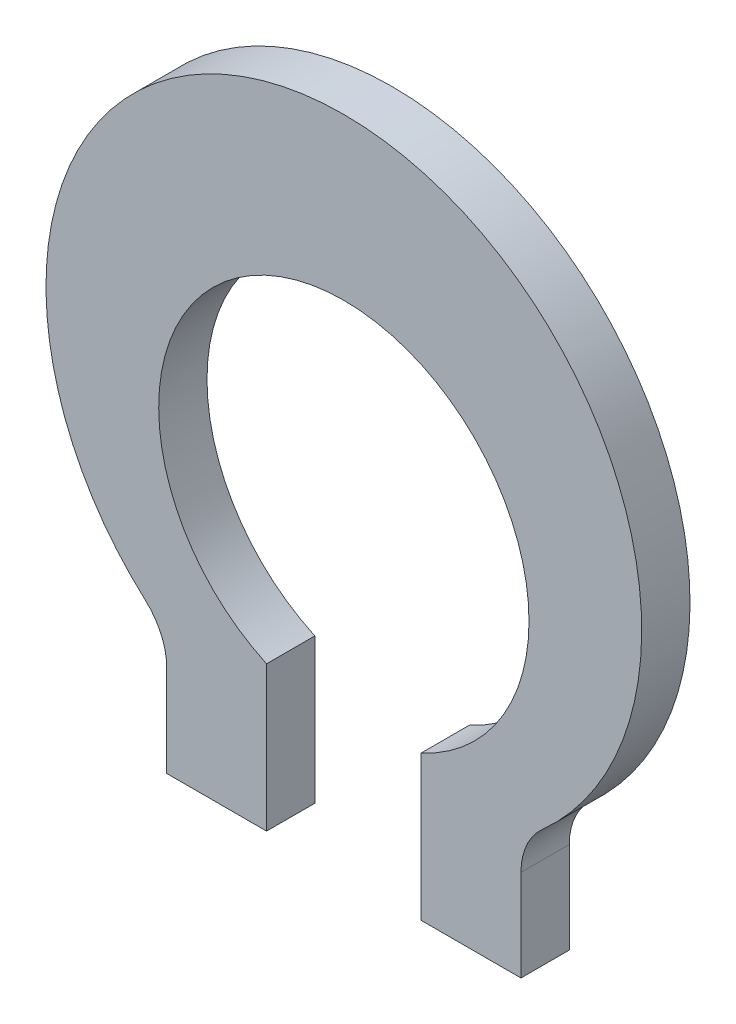
ISO-10303-21;
HEADER;
FILE_DESCRIPTION(('STEP AP214'),'2;1');
FILE_NAME('part.step','',(''),(''),'','','');
FILE_SCHEMA(('AUTOMOTIVE_DESIGN { 1 0 10303 214 1 1 1 1 }'));
ENDSEC;
DATA;
#1=APPLICATION_CONTEXT('core data for automotive mechanical design processes');
#2=APPLICATION_PROTOCOL_DEFINITION('international standard','automotive_design',2000,#1);
#3=PRODUCT_CONTEXT('',#1,'mechanical');
#4=PRODUCT('Part','Part','',(#3));
#5=PRODUCT_RELATED_PRODUCT_CATEGORY('part','',(#4));
#6=PRODUCT_DEFINITION_FORMATION('','',#4);
#7=PRODUCT_DEFINITION_CONTEXT('part definition',#1,'design');
#8=PRODUCT_DEFINITION('design','',#6,#7);
#9=PRODUCT_DEFINITION_SHAPE('','',#8);
#10=(LENGTH_UNIT() NAMED_UNIT(*) SI_UNIT(.MILLI.,.METRE.));
#11=(NAMED_UNIT(*) PLANE_ANGLE_UNIT() SI_UNIT($,.RADIAN.));
#12=(NAMED_UNIT(*) SI_UNIT($,.STERADIAN.) SOLID_ANGLE_UNIT());
#13=UNCERTAINTY_MEASURE_WITH_UNIT(LENGTH_MEASURE(1.E-05),#10,'distance_accuracy_value','');
#14=(GEOMETRIC_REPRESENTATION_CONTEXT(3) GLOBAL_UNCERTAINTY_ASSIGNED_CONTEXT((#13)) GLOBAL_UNIT_ASSIGNED_CONTEXT((#10,
#11,#12)) REPRESENTATION_CONTEXT('',''));
#15=CARTESIAN_POINT('',(0.,0.,0.));
#16=DIRECTION('',(0.,0.,1.));
#17=DIRECTION('',(1.,0.,0.));
#18=AXIS2_PLACEMENT_3D('',#15,#16,#17);
#19=CARTESIAN_POINT('',(0.,9.7251794227567,1.5));
#20=DIRECTION('',(0.,0.,-1.));
#21=DIRECTION('',(-1.,0.,0.));
#22=AXIS2_PLACEMENT_3D('',#19,#20,#21);
#23=CYLINDRICAL_SURFACE('',#22,5.75);
#24=CARTESIAN_POINT('',(0.,9.7251794227567,0.));
#25=DIRECTION('',(0.,0.,1.));
#26=DIRECTION('',(1.,0.,0.));
#27=AXIS2_PLACEMENT_3D('',#24,#25,#26);
#28=CIRCLE('',#27,5.75);
#29=CARTESIAN_POINT('',(2.4,4.5,0.));
#30=VERTEX_POINT('',#29);
#31=CARTESIAN_POINT('',(-2.4,4.5,0.));
#32=VERTEX_POINT('',#31);
#33=EDGE_CURVE('E127',#30,#32,#28,.T.);
#34=ORIENTED_EDGE('',*,*,#33,.F.);
#35=DIRECTION('',(0.,0.,-1.));
#36=VECTOR('',#35,1.);
#37=CARTESIAN_POINT('',(2.4,4.5,1.5));
#38=LINE('',#37,#36);
#39=CARTESIAN_POINT('',(2.4,4.5,1.5));
#40=VERTEX_POINT('',#39);
#41=EDGE_CURVE('E123',#40,#30,#38,.T.);
#42=ORIENTED_EDGE('',*,*,#41,.F.);
#43=CARTESIAN_POINT('',(0.,9.7251794227567,1.5));
#44=DIRECTION('',(0.,0.,1.));
#45=DIRECTION('',(1.,0.,0.));
#46=AXIS2_PLACEMENT_3D('',#43,#44,#45);
#47=CIRCLE('',#46,5.75);
#48=CARTESIAN_POINT('',(-2.4,4.5,1.5));
#49=VERTEX_POINT('',#48);
#50=EDGE_CURVE('E125',#40,#49,#47,.T.);
#51=ORIENTED_EDGE('',*,*,#50,.T.);
#52=DIRECTION('',(0.,0.,-1.));
#53=VECTOR('',#52,1.);
#54=CARTESIAN_POINT('',(-2.4,4.5,1.5));
#55=LINE('',#54,#53);
#56=EDGE_CURVE('E163',#49,#32,#55,.T.);
#57=ORIENTED_EDGE('',*,*,#56,.T.);
#58=EDGE_LOOP('',(#34,#42,#51,#57));
#59=FACE_BOUND('',#58,.T.);
#60=ADVANCED_FACE('F46',(#59),#23,.F.);
#61=CARTESIAN_POINT('',(2.4,0.,1.5));
#62=DIRECTION('',(-1.,0.,0.));
#63=DIRECTION('',(0.,0.,1.));
#64=AXIS2_PLACEMENT_3D('',#61,#62,#63);
#65=PLANE('',#64);
#66=DIRECTION('',(0.,1.,0.));
#67=VECTOR('',#66,1.);
#68=CARTESIAN_POINT('',(2.4,0.,0.));
#69=LINE('',#68,#67);
#70=CARTESIAN_POINT('',(2.4,0.,0.));
#71=VERTEX_POINT('',#70);
#72=EDGE_CURVE('E165',#71,#30,#69,.T.);
#73=ORIENTED_EDGE('',*,*,#72,.F.);
#74=DIRECTION('',(0.,0.,-1.));
#75=VECTOR('',#74,1.);
#76=CARTESIAN_POINT('',(2.4,0.,1.5));
#77=LINE('',#76,#75);
#78=CARTESIAN_POINT('',(2.4,0.,1.5));
#79=VERTEX_POINT('',#78);
#80=EDGE_CURVE('E133',#79,#71,#77,.T.);
#81=ORIENTED_EDGE('',*,*,#80,.F.);
#82=DIRECTION('',(0.,1.,0.));
#83=VECTOR('',#82,1.);
#84=CARTESIAN_POINT('',(2.4,0.,1.5));
#85=LINE('',#84,#83);
#86=EDGE_CURVE('E138',#79,#40,#85,.T.);
#87=ORIENTED_EDGE('',*,*,#86,.T.);
#88=ORIENTED_EDGE('',*,*,#41,.T.);
#89=EDGE_LOOP('',(#73,#81,#87,#88));
#90=FACE_BOUND('',#89,.T.);
#91=ADVANCED_FACE('F145',(#90),#65,.T.);
#92=CARTESIAN_POINT('',(0.,0.,1.5));
#93=DIRECTION('',(0.,1.,0.));
#94=DIRECTION('',(0.,0.,1.));
#95=AXIS2_PLACEMENT_3D('',#92,#93,#94);
#96=PLANE('',#95);
#97=DIRECTION('',(1.,0.,0.));
#98=VECTOR('',#97,1.);
#99=CARTESIAN_POINT('',(0.,0.,0.));
#100=LINE('',#99,#98);
#101=CARTESIAN_POINT('',(5.5,0.,0.));
#102=VERTEX_POINT('',#101);
#103=EDGE_CURVE('E167',#71,#102,#100,.T.);
#104=ORIENTED_EDGE('',*,*,#103,.T.);
#105=DIRECTION('',(0.,0.,-1.));
#106=VECTOR('',#105,1.);
#107=CARTESIAN_POINT('',(5.5,0.,1.5));
#108=LINE('',#107,#106);
#109=CARTESIAN_POINT('',(5.5,0.,1.5));
#110=VERTEX_POINT('',#109);
#111=EDGE_CURVE('E187',#110,#102,#108,.T.);
#112=ORIENTED_EDGE('',*,*,#111,.F.);
#113=DIRECTION('',(1.,0.,0.));
#114=VECTOR('',#113,1.);
#115=CARTESIAN_POINT('',(0.,0.,1.5));
#116=LINE('',#115,#114);
#117=EDGE_CURVE('E147',#79,#110,#116,.T.);
#118=ORIENTED_EDGE('',*,*,#117,.F.);
#119=ORIENTED_EDGE('',*,*,#80,.T.);
#120=EDGE_LOOP('',(#104,#112,#118,#119));
#121=FACE_BOUND('',#120,.T.);
#122=ADVANCED_FACE('F222',(#121),#96,.F.);
#123=CARTESIAN_POINT('',(5.5,0.,1.5));
#124=DIRECTION('',(-1.,0.,0.));
#125=DIRECTION('',(0.,0.,1.));
#126=AXIS2_PLACEMENT_3D('',#123,#124,#125);
#127=PLANE('',#126);
#128=DIRECTION('',(0.,1.,0.));
#129=VECTOR('',#128,1.);
#130=CARTESIAN_POINT('',(5.5,0.,0.));
#131=LINE('',#130,#129);
#132=CARTESIAN_POINT('',(5.5,2.83992450713249,0.));
#133=VERTEX_POINT('',#132);
#134=EDGE_CURVE('E169',#102,#133,#131,.T.);
#135=ORIENTED_EDGE('',*,*,#134,.T.);
#136=DIRECTION('',(0.,0.,1.));
#137=VECTOR('',#136,1.);
#138=CARTESIAN_POINT('',(5.5,2.83992450713249,1.5));
#139=LINE('',#138,#137);
#140=CARTESIAN_POINT('',(5.5,2.83992450713249,1.5));
#141=VERTEX_POINT('',#140);
#142=EDGE_CURVE('E61',#133,#141,#139,.T.);
#143=ORIENTED_EDGE('',*,*,#142,.T.);
#144=DIRECTION('',(0.,1.,0.));
#145=VECTOR('',#144,1.);
#146=CARTESIAN_POINT('',(5.5,0.,1.5));
#147=LINE('',#146,#145);
#148=EDGE_CURVE('E149',#110,#141,#147,.T.);
#149=ORIENTED_EDGE('',*,*,#148,.F.);
#150=ORIENTED_EDGE('',*,*,#111,.T.);
#151=EDGE_LOOP('',(#135,#143,#149,#150));
#152=FACE_BOUND('',#151,.T.);
#153=ADVANCED_FACE('F219',(#152),#127,.F.);
#154=CARTESIAN_POINT('',(0.,11.2251794227567,1.5));
#155=DIRECTION('',(0.,0.,-1.));
#156=DIRECTION('',(-1.,0.,0.));
#157=AXIS2_PLACEMENT_3D('',#154,#155,#156);
#158=CYLINDRICAL_SURFACE('',#157,9.25);
#159=CARTESIAN_POINT('',(0.,11.2251794227567,0.));
#160=DIRECTION('',(0.,0.,1.));
#161=DIRECTION('',(1.,0.,0.));
#162=AXIS2_PLACEMENT_3D('',#159,#160,#161);
#163=CIRCLE('',#162,9.25);
#164=CARTESIAN_POINT('',(6.16666666666667,4.33063649213235,0.));
#165=VERTEX_POINT('',#164);
#166=CARTESIAN_POINT('',(-6.16666666666667,4.33063649213235,0.));
#167=VERTEX_POINT('',#166);
#168=EDGE_CURVE('E171',#165,#167,#163,.T.);
#169=ORIENTED_EDGE('',*,*,#168,.T.);
#170=DIRECTION('',(0.,0.,-1.));
#171=VECTOR('',#170,1.);
#172=CARTESIAN_POINT('',(-6.16666666666667,4.33063649213235,1.5));
#173=LINE('',#172,#171);
#174=CARTESIAN_POINT('',(-6.16666666666667,4.33063649213235,1.5));
#175=VERTEX_POINT('',#174);
#176=EDGE_CURVE('E196',#167,#175,#173,.F.);
#177=ORIENTED_EDGE('',*,*,#176,.T.);
#178=CARTESIAN_POINT('',(0.,11.2251794227567,1.5));
#179=DIRECTION('',(0.,0.,1.));
#180=DIRECTION('',(1.,0.,0.));
#181=AXIS2_PLACEMENT_3D('',#178,#179,#180);
#182=CIRCLE('',#181,9.25);
#183=CARTESIAN_POINT('',(6.16666666666667,4.33063649213235,1.5));
#184=VERTEX_POINT('',#183);
#185=EDGE_CURVE('E153',#184,#175,#182,.T.);
#186=ORIENTED_EDGE('',*,*,#185,.F.);
#187=DIRECTION('',(0.,0.,-1.));
#188=VECTOR('',#187,1.);
#189=CARTESIAN_POINT('',(6.16666666666667,4.33063649213235,1.5));
#190=LINE('',#189,#188);
#191=EDGE_CURVE('E193',#184,#165,#190,.T.);
#192=ORIENTED_EDGE('',*,*,#191,.T.);
#193=EDGE_LOOP('',(#169,#177,#186,#192));
#194=FACE_BOUND('',#193,.T.);
#195=ADVANCED_FACE('F214',(#194),#158,.T.);
#196=CARTESIAN_POINT('',(-5.5,0.,1.5));
#197=DIRECTION('',(-1.,0.,0.));
#198=DIRECTION('',(0.,0.,1.));
#199=AXIS2_PLACEMENT_3D('',#196,#197,#198);
#200=PLANE('',#199);
#201=DIRECTION('',(0.,1.,0.));
#202=VECTOR('',#201,1.);
#203=CARTESIAN_POINT('',(-5.5,0.,1.5));
#204=LINE('',#203,#202);
#205=CARTESIAN_POINT('',(-5.5,0.,1.5));
#206=VERTEX_POINT('',#205);
#207=CARTESIAN_POINT('',(-5.5,2.83992450713249,1.5));
#208=VERTEX_POINT('',#207);
#209=EDGE_CURVE('E156',#206,#208,#204,.T.);
#210=ORIENTED_EDGE('',*,*,#209,.T.);
#211=DIRECTION('',(0.,0.,-1.));
#212=VECTOR('',#211,1.);
#213=CARTESIAN_POINT('',(-5.5,2.83992450713249,1.5));
#214=LINE('',#213,#212);
#215=CARTESIAN_POINT('',(-5.5,2.83992450713249,0.));
#216=VERTEX_POINT('',#215);
#217=EDGE_CURVE('E132',#208,#216,#214,.T.);
#218=ORIENTED_EDGE('',*,*,#217,.T.);
#219=DIRECTION('',(0.,1.,0.));
#220=VECTOR('',#219,1.);
#221=CARTESIAN_POINT('',(-5.5,0.,0.));
#222=LINE('',#221,#220);
#223=CARTESIAN_POINT('',(-5.5,0.,0.));
#224=VERTEX_POINT('',#223);
#225=EDGE_CURVE('E174',#224,#216,#222,.T.);
#226=ORIENTED_EDGE('',*,*,#225,.F.);
#227=DIRECTION('',(0.,0.,-1.));
#228=VECTOR('',#227,1.);
#229=CARTESIAN_POINT('',(-5.5,0.,1.5));
#230=LINE('',#229,#228);
#231=EDGE_CURVE('E185',#206,#224,#230,.T.);
#232=ORIENTED_EDGE('',*,*,#231,.F.);
#233=EDGE_LOOP('',(#210,#218,#226,#232));
#234=FACE_BOUND('',#233,.T.);
#235=ADVANCED_FACE('F209',(#234),#200,.T.);
#236=CARTESIAN_POINT('',(0.,0.,1.5));
#237=DIRECTION('',(0.,-1.,0.));
#238=DIRECTION('',(0.,0.,-1.));
#239=AXIS2_PLACEMENT_3D('',#236,#237,#238);
#240=PLANE('',#239);
#241=DIRECTION('',(-1.,0.,0.));
#242=VECTOR('',#241,1.);
#243=CARTESIAN_POINT('',(0.,0.,0.));
#244=LINE('',#243,#242);
#245=CARTESIAN_POINT('',(-2.4,0.,0.));
#246=VERTEX_POINT('',#245);
#247=EDGE_CURVE('E177',#246,#224,#244,.T.);
#248=ORIENTED_EDGE('',*,*,#247,.F.);
#249=DIRECTION('',(0.,0.,-1.));
#250=VECTOR('',#249,1.);
#251=CARTESIAN_POINT('',(-2.4,0.,1.5));
#252=LINE('',#251,#250);
#253=CARTESIAN_POINT('',(-2.4,0.,1.5));
#254=VERTEX_POINT('',#253);
#255=EDGE_CURVE('E183',#254,#246,#252,.T.);
#256=ORIENTED_EDGE('',*,*,#255,.F.);
#257=DIRECTION('',(-1.,0.,0.));
#258=VECTOR('',#257,1.);
#259=CARTESIAN_POINT('',(0.,0.,1.5));
#260=LINE('',#259,#258);
#261=EDGE_CURVE('E159',#254,#206,#260,.T.);
#262=ORIENTED_EDGE('',*,*,#261,.T.);
#263=ORIENTED_EDGE('',*,*,#231,.T.);
#264=EDGE_LOOP('',(#248,#256,#262,#263));
#265=FACE_BOUND('',#264,.T.);
#266=ADVANCED_FACE('F249',(#265),#240,.T.);
#267=CARTESIAN_POINT('',(-2.4,0.,1.5));
#268=DIRECTION('',(-1.,0.,0.));
#269=DIRECTION('',(0.,0.,1.));
#270=AXIS2_PLACEMENT_3D('',#267,#268,#269);
#271=PLANE('',#270);
#272=DIRECTION('',(0.,1.,0.));
#273=VECTOR('',#272,1.);
#274=CARTESIAN_POINT('',(-2.4,0.,0.));
#275=LINE('',#274,#273);
#276=EDGE_CURVE('E143',#246,#32,#275,.T.);
#277=ORIENTED_EDGE('',*,*,#276,.T.);
#278=ORIENTED_EDGE('',*,*,#56,.F.);
#279=DIRECTION('',(0.,1.,0.));
#280=VECTOR('',#279,1.);
#281=CARTESIAN_POINT('',(-2.4,0.,1.5));
#282=LINE('',#281,#280);
#283=EDGE_CURVE('E141',#254,#49,#282,.T.);
#284=ORIENTED_EDGE('',*,*,#283,.F.);
#285=ORIENTED_EDGE('',*,*,#255,.T.);
#286=EDGE_LOOP('',(#277,#278,#284,#285));
#287=FACE_BOUND('',#286,.T.);
#288=ADVANCED_FACE('F244',(#287),#271,.F.);
#289=CARTESIAN_POINT('',(0.,0.,1.5));
#290=DIRECTION('',(0.,0.,1.));
#291=DIRECTION('',(1.,0.,0.));
#292=AXIS2_PLACEMENT_3D('',#289,#290,#291);
#293=PLANE('',#292);
#294=ORIENTED_EDGE('',*,*,#50,.F.);
#295=ORIENTED_EDGE('',*,*,#86,.F.);
#296=ORIENTED_EDGE('',*,*,#117,.T.);
#297=ORIENTED_EDGE('',*,*,#148,.T.);
#298=CARTESIAN_POINT('',(7.5,2.83992450713249,1.5));
#299=DIRECTION('',(0.,0.,1.));
#300=DIRECTION('',(1.,0.,0.));
#301=AXIS2_PLACEMENT_3D('',#298,#299,#300);
#302=CIRCLE('',#301,2.);
#303=EDGE_CURVE('E13',#141,#184,#302,.F.);
#304=ORIENTED_EDGE('',*,*,#303,.T.);
#305=ORIENTED_EDGE('',*,*,#185,.T.);
#306=CARTESIAN_POINT('',(-7.5,2.83992450713249,1.5));
#307=DIRECTION('',(0.,0.,1.));
#308=DIRECTION('',(1.,0.,0.));
#309=AXIS2_PLACEMENT_3D('',#306,#307,#308);
#310=CIRCLE('',#309,2.);
#311=EDGE_CURVE('E201',#175,#208,#310,.F.);
#312=ORIENTED_EDGE('',*,*,#311,.T.);
#313=ORIENTED_EDGE('',*,*,#209,.F.);
#314=ORIENTED_EDGE('',*,*,#261,.F.);
#315=ORIENTED_EDGE('',*,*,#283,.T.);
#316=EDGE_LOOP('',(#294,#295,#296,#297,#304,#305,#312,#313,#314,#315));
#317=FACE_BOUND('',#316,.T.);
#318=ADVANCED_FACE('F137',(#317),#293,.T.);
#319=CARTESIAN_POINT('',(0.,0.,0.));
#320=DIRECTION('',(0.,0.,1.));
#321=DIRECTION('',(1.,0.,0.));
#322=AXIS2_PLACEMENT_3D('',#319,#320,#321);
#323=PLANE('',#322);
#324=ORIENTED_EDGE('',*,*,#33,.T.);
#325=ORIENTED_EDGE('',*,*,#276,.F.);
#326=ORIENTED_EDGE('',*,*,#247,.T.);
#327=ORIENTED_EDGE('',*,*,#225,.T.);
#328=CARTESIAN_POINT('',(-7.5,2.83992450713249,0.));
#329=DIRECTION('',(0.,0.,1.));
#330=DIRECTION('',(1.,0.,0.));
#331=AXIS2_PLACEMENT_3D('',#328,#329,#330);
#332=CIRCLE('',#331,2.);
#333=EDGE_CURVE('E199',#216,#167,#332,.T.);
#334=ORIENTED_EDGE('',*,*,#333,.T.);
#335=ORIENTED_EDGE('',*,*,#168,.F.);
#336=CARTESIAN_POINT('',(7.5,2.83992450713249,0.));
#337=DIRECTION('',(0.,0.,1.));
#338=DIRECTION('',(1.,0.,0.));
#339=AXIS2_PLACEMENT_3D('',#336,#337,#338);
#340=CIRCLE('',#339,2.);
#341=EDGE_CURVE('E54',#165,#133,#340,.T.);
#342=ORIENTED_EDGE('',*,*,#341,.T.);
#343=ORIENTED_EDGE('',*,*,#134,.F.);
#344=ORIENTED_EDGE('',*,*,#103,.F.);
#345=ORIENTED_EDGE('',*,*,#72,.T.);
#346=EDGE_LOOP('',(#324,#325,#326,#327,#334,#335,#342,#343,#344,#345));
#347=FACE_BOUND('',#346,.T.);
#348=ADVANCED_FACE('F212',(#347),#323,.F.);
#349=CARTESIAN_POINT('',(-7.5,2.83992450713249,1.5));
#350=DIRECTION('',(0.,0.,-1.));
#351=DIRECTION('',(-1.,0.,0.));
#352=AXIS2_PLACEMENT_3D('',#349,#350,#351);
#353=CYLINDRICAL_SURFACE('',#352,2.);
#354=ORIENTED_EDGE('',*,*,#311,.F.);
#355=ORIENTED_EDGE('',*,*,#176,.F.);
#356=ORIENTED_EDGE('',*,*,#333,.F.);
#357=ORIENTED_EDGE('',*,*,#217,.F.);
#358=EDGE_LOOP('',(#354,#355,#356,#357));
#359=FACE_BOUND('',#358,.T.);
#360=ADVANCED_FACE('F211',(#359),#353,.F.);
#361=CARTESIAN_POINT('',(7.5,2.83992450713249,1.5));
#362=DIRECTION('',(0.,0.,-1.));
#363=DIRECTION('',(-1.,0.,0.));
#364=AXIS2_PLACEMENT_3D('',#361,#362,#363);
#365=CYLINDRICAL_SURFACE('',#364,2.);
#366=ORIENTED_EDGE('',*,*,#303,.F.);
#367=ORIENTED_EDGE('',*,*,#142,.F.);
#368=ORIENTED_EDGE('',*,*,#341,.F.);
#369=ORIENTED_EDGE('',*,*,#191,.F.);
#370=EDGE_LOOP('',(#366,#367,#368,#369));
#371=FACE_BOUND('',#370,.T.);
#372=ADVANCED_FACE('F48',(#371),#365,.F.);
#373=CLOSED_SHELL('',(#60,#91,#122,#153,#195,#235,#266,#288,#318,#348,#360,#372));
#374=MANIFOLD_SOLID_BREP('B2',#373);
#375=ADVANCED_BREP_SHAPE_REPRESENTATION('',(#18,#374),#14);
#376=SHAPE_DEFINITION_REPRESENTATION(#9,#375);
ENDSEC;
END-ISO-10303-21;
